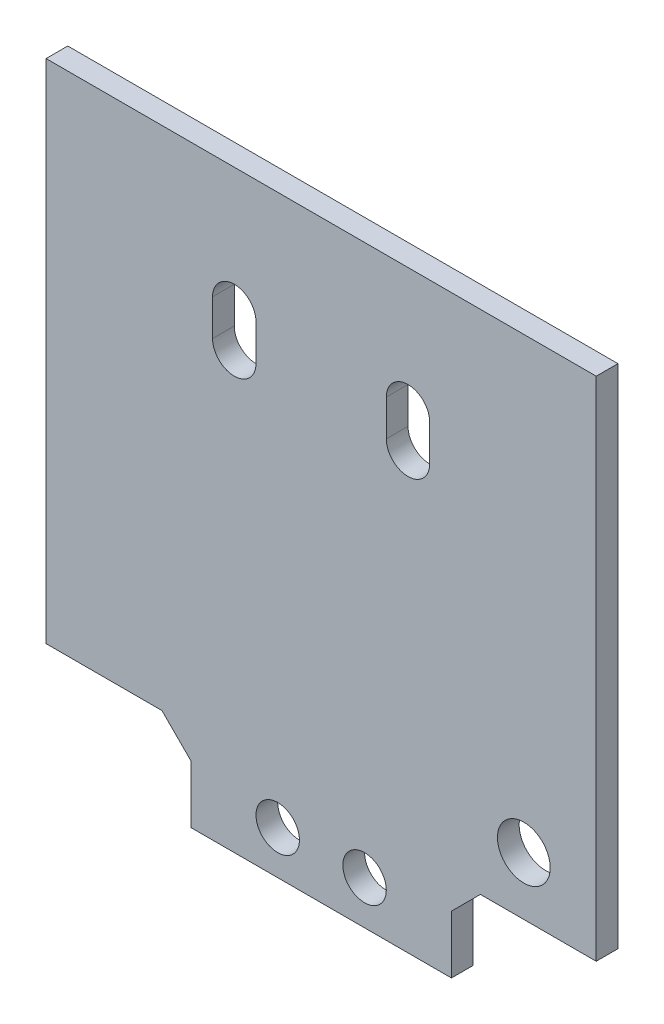
ISO-10303-21;
HEADER;
FILE_DESCRIPTION(('STEP AP214'),'2;1');
FILE_NAME('part.step','',(''),(''),'','','');
FILE_SCHEMA(('AUTOMOTIVE_DESIGN { 1 0 10303 214 1 1 1 1 }'));
ENDSEC;
DATA;
#1=APPLICATION_CONTEXT('core data for automotive mechanical design processes');
#2=APPLICATION_PROTOCOL_DEFINITION('international standard','automotive_design',2000,#1);
#3=PRODUCT_CONTEXT('',#1,'mechanical');
#4=PRODUCT('Part','Part','',(#3));
#5=PRODUCT_RELATED_PRODUCT_CATEGORY('part','',(#4));
#6=PRODUCT_DEFINITION_FORMATION('','',#4);
#7=PRODUCT_DEFINITION_CONTEXT('part definition',#1,'design');
#8=PRODUCT_DEFINITION('design','',#6,#7);
#9=PRODUCT_DEFINITION_SHAPE('','',#8);
#10=(LENGTH_UNIT() NAMED_UNIT(*) SI_UNIT(.MILLI.,.METRE.));
#11=(NAMED_UNIT(*) PLANE_ANGLE_UNIT() SI_UNIT($,.RADIAN.));
#12=(NAMED_UNIT(*) SI_UNIT($,.STERADIAN.) SOLID_ANGLE_UNIT());
#13=UNCERTAINTY_MEASURE_WITH_UNIT(LENGTH_MEASURE(1.E-05),#10,'distance_accuracy_value','');
#14=(GEOMETRIC_REPRESENTATION_CONTEXT(3) GLOBAL_UNCERTAINTY_ASSIGNED_CONTEXT((#13)) GLOBAL_UNIT_ASSIGNED_CONTEXT((#10,
#11,#12)) REPRESENTATION_CONTEXT('',''));
#15=CARTESIAN_POINT('',(0.,0.,0.));
#16=DIRECTION('',(0.,0.,1.));
#17=DIRECTION('',(1.,0.,0.));
#18=AXIS2_PLACEMENT_3D('',#15,#16,#17);
#19=CARTESIAN_POINT('',(0.,0.,1.5));
#20=DIRECTION('',(0.,0.,-1.));
#21=DIRECTION('',(-1.,0.,0.));
#22=AXIS2_PLACEMENT_3D('',#19,#20,#21);
#23=PLANE('',#22);
#24=CARTESIAN_POINT('',(25.,-8.5,1.5));
#25=DIRECTION('',(0.,0.,1.));
#26=DIRECTION('',(1.,0.,0.));
#27=AXIS2_PLACEMENT_3D('',#24,#25,#26);
#28=CIRCLE('',#27,1.50000000000001);
#29=CARTESIAN_POINT('',(26.5,-8.5,1.5));
#30=VERTEX_POINT('',#29);
#31=CARTESIAN_POINT('',(23.5,-8.5,1.5));
#32=VERTEX_POINT('',#31);
#33=EDGE_CURVE('E201',#30,#32,#28,.T.);
#34=ORIENTED_EDGE('',*,*,#33,.F.);
#35=DIRECTION('',(0.,1.,0.));
#36=VECTOR('',#35,1.);
#37=CARTESIAN_POINT('',(26.5,-8.5,1.5));
#38=LINE('',#37,#36);
#39=CARTESIAN_POINT('',(26.5,-11.,1.5));
#40=VERTEX_POINT('',#39);
#41=EDGE_CURVE('E209',#40,#30,#38,.T.);
#42=ORIENTED_EDGE('',*,*,#41,.F.);
#43=CARTESIAN_POINT('',(25.,-11.,1.5));
#44=DIRECTION('',(0.,0.,1.));
#45=DIRECTION('',(1.,0.,0.));
#46=AXIS2_PLACEMENT_3D('',#43,#44,#45);
#47=CIRCLE('',#46,1.49999999999999);
#48=CARTESIAN_POINT('',(23.5,-11.,1.5));
#49=VERTEX_POINT('',#48);
#50=EDGE_CURVE('E206',#49,#40,#47,.T.);
#51=ORIENTED_EDGE('',*,*,#50,.F.);
#52=DIRECTION('',(0.,-1.,0.));
#53=VECTOR('',#52,1.);
#54=CARTESIAN_POINT('',(23.5,-8.5,1.5));
#55=LINE('',#54,#53);
#56=EDGE_CURVE('E203',#32,#49,#55,.T.);
#57=ORIENTED_EDGE('',*,*,#56,.F.);
#58=EDGE_LOOP('',(#34,#42,#51,#57));
#59=FACE_BOUND('',#58,.T.);
#60=DIRECTION('',(0.,-1.,0.));
#61=VECTOR('',#60,1.);
#62=CARTESIAN_POINT('',(0.,-35.,1.5));
#63=LINE('',#62,#61);
#64=CARTESIAN_POINT('',(0.,0.,1.5));
#65=VERTEX_POINT('',#64);
#66=CARTESIAN_POINT('',(0.,-35.,1.5));
#67=VERTEX_POINT('',#66);
#68=EDGE_CURVE('E250',#65,#67,#63,.T.);
#69=ORIENTED_EDGE('',*,*,#68,.T.);
#70=DIRECTION('',(1.,0.,0.));
#71=VECTOR('',#70,1.);
#72=CARTESIAN_POINT('',(5.88929889298893,-35.,1.5));
#73=LINE('',#72,#71);
#74=CARTESIAN_POINT('',(8.00000000000001,-35.,1.5));
#75=VERTEX_POINT('',#74);
#76=EDGE_CURVE('E253',#67,#75,#73,.T.);
#77=ORIENTED_EDGE('',*,*,#76,.T.);
#78=DIRECTION('',(-0.707106781186544,0.707106781186551,0.));
#79=VECTOR('',#78,1.);
#80=CARTESIAN_POINT('',(-13.5,-13.4999999999998,1.5));
#81=LINE('',#80,#79);
#82=CARTESIAN_POINT('',(10.,-37.,1.5));
#83=VERTEX_POINT('',#82);
#84=EDGE_CURVE('E315',#75,#83,#81,.F.);
#85=ORIENTED_EDGE('',*,*,#84,.T.);
#86=DIRECTION('',(0.,-1.,0.));
#87=VECTOR('',#86,1.);
#88=CARTESIAN_POINT('',(10.,-35.,1.5));
#89=LINE('',#88,#87);
#90=CARTESIAN_POINT('',(10.,-41.,1.5));
#91=VERTEX_POINT('',#90);
#92=EDGE_CURVE('E257',#83,#91,#89,.T.);
#93=ORIENTED_EDGE('',*,*,#92,.T.);
#94=DIRECTION('',(1.,0.,0.));
#95=VECTOR('',#94,1.);
#96=CARTESIAN_POINT('',(28.,-41.,1.5));
#97=LINE('',#96,#95);
#98=CARTESIAN_POINT('',(28.,-41.,1.5));
#99=VERTEX_POINT('',#98);
#100=EDGE_CURVE('E259',#91,#99,#97,.T.);
#101=ORIENTED_EDGE('',*,*,#100,.T.);
#102=DIRECTION('',(0.,1.,0.));
#103=VECTOR('',#102,1.);
#104=CARTESIAN_POINT('',(28.,-40.3970599589862,1.5));
#105=LINE('',#104,#103);
#106=CARTESIAN_POINT('',(28.,-37.,1.5));
#107=VERTEX_POINT('',#106);
#108=EDGE_CURVE('E261',#99,#107,#105,.T.);
#109=ORIENTED_EDGE('',*,*,#108,.T.);
#110=DIRECTION('',(-0.707106781186551,-0.707106781186544,0.));
#111=VECTOR('',#110,1.);
#112=CARTESIAN_POINT('',(32.4999999999999,-32.5000000000002,1.5));
#113=LINE('',#112,#111);
#114=CARTESIAN_POINT('',(30.,-35.,1.5));
#115=VERTEX_POINT('',#114);
#116=EDGE_CURVE('E11',#107,#115,#113,.F.);
#117=ORIENTED_EDGE('',*,*,#116,.T.);
#118=DIRECTION('',(1.,0.,0.));
#119=VECTOR('',#118,1.);
#120=CARTESIAN_POINT('',(31.0601126882369,-35.,1.5));
#121=LINE('',#120,#119);
#122=CARTESIAN_POINT('',(38.,-35.,1.5));
#123=VERTEX_POINT('',#122);
#124=EDGE_CURVE('E263',#115,#123,#121,.T.);
#125=ORIENTED_EDGE('',*,*,#124,.T.);
#126=DIRECTION('',(0.,1.,0.));
#127=VECTOR('',#126,1.);
#128=CARTESIAN_POINT('',(38.,0.,1.5));
#129=LINE('',#128,#127);
#130=CARTESIAN_POINT('',(38.,0.,1.5));
#131=VERTEX_POINT('',#130);
#132=EDGE_CURVE('E265',#123,#131,#129,.T.);
#133=ORIENTED_EDGE('',*,*,#132,.T.);
#134=DIRECTION('',(-1.,0.,0.));
#135=VECTOR('',#134,1.);
#136=CARTESIAN_POINT('',(0.,0.,1.5));
#137=LINE('',#136,#135);
#138=EDGE_CURVE('E267',#131,#65,#137,.T.);
#139=ORIENTED_EDGE('',*,*,#138,.T.);
#140=EDGE_LOOP('',(#69,#77,#85,#93,#101,#109,#117,#125,#133,#139));
#141=FACE_BOUND('',#140,.T.);
#142=CARTESIAN_POINT('',(16.,-38.,1.5));
#143=DIRECTION('',(0.,0.,1.));
#144=DIRECTION('',(1.,0.,0.));
#145=AXIS2_PLACEMENT_3D('',#142,#143,#144);
#146=CIRCLE('',#145,1.5);
#147=CARTESIAN_POINT('',(17.5,-38.,1.5));
#148=VERTEX_POINT('',#147);
#149=EDGE_CURVE('E244',#148,#148,#146,.T.);
#150=ORIENTED_EDGE('',*,*,#149,.F.);
#151=EDGE_LOOP('',(#150));
#152=FACE_BOUND('',#151,.T.);
#153=CARTESIAN_POINT('',(22.,-38.,1.5));
#154=DIRECTION('',(0.,0.,1.));
#155=DIRECTION('',(1.,0.,0.));
#156=AXIS2_PLACEMENT_3D('',#153,#154,#155);
#157=CIRCLE('',#156,1.5);
#158=CARTESIAN_POINT('',(23.5,-38.,1.5));
#159=VERTEX_POINT('',#158);
#160=EDGE_CURVE('E238',#159,#159,#157,.T.);
#161=ORIENTED_EDGE('',*,*,#160,.F.);
#162=EDGE_LOOP('',(#161));
#163=FACE_BOUND('',#162,.T.);
#164=CARTESIAN_POINT('',(33.,-31.,1.5));
#165=DIRECTION('',(0.,0.,1.));
#166=DIRECTION('',(1.,0.,0.));
#167=AXIS2_PLACEMENT_3D('',#164,#165,#166);
#168=CIRCLE('',#167,1.82239288771104);
#169=CARTESIAN_POINT('',(34.822392887711,-31.,1.5));
#170=VERTEX_POINT('',#169);
#171=EDGE_CURVE('E232',#170,#170,#168,.T.);
#172=ORIENTED_EDGE('',*,*,#171,.F.);
#173=EDGE_LOOP('',(#172));
#174=FACE_BOUND('',#173,.T.);
#175=CARTESIAN_POINT('',(13.,-8.5,1.5));
#176=DIRECTION('',(0.,0.,1.));
#177=DIRECTION('',(-1.,0.,0.));
#178=AXIS2_PLACEMENT_3D('',#175,#176,#177);
#179=CIRCLE('',#178,1.50000000000001);
#180=CARTESIAN_POINT('',(14.5,-8.5,1.5));
#181=VERTEX_POINT('',#180);
#182=CARTESIAN_POINT('',(11.5,-8.5,1.5));
#183=VERTEX_POINT('',#182);
#184=EDGE_CURVE('E160',#181,#183,#179,.T.);
#185=ORIENTED_EDGE('',*,*,#184,.F.);
#186=DIRECTION('',(0.,1.,0.));
#187=VECTOR('',#186,1.);
#188=CARTESIAN_POINT('',(14.5,-8.5,1.5));
#189=LINE('',#188,#187);
#190=CARTESIAN_POINT('',(14.5,-11.,1.5));
#191=VERTEX_POINT('',#190);
#192=EDGE_CURVE('E185',#191,#181,#189,.T.);
#193=ORIENTED_EDGE('',*,*,#192,.F.);
#194=CARTESIAN_POINT('',(13.,-11.,1.5));
#195=DIRECTION('',(0.,0.,1.));
#196=DIRECTION('',(-1.,0.,0.));
#197=AXIS2_PLACEMENT_3D('',#194,#195,#196);
#198=CIRCLE('',#197,1.49999999999999);
#199=CARTESIAN_POINT('',(11.5,-11.,1.5));
#200=VERTEX_POINT('',#199);
#201=EDGE_CURVE('E183',#200,#191,#198,.T.);
#202=ORIENTED_EDGE('',*,*,#201,.F.);
#203=DIRECTION('',(0.,-1.,0.));
#204=VECTOR('',#203,1.);
#205=CARTESIAN_POINT('',(11.5,-8.5,1.5));
#206=LINE('',#205,#204);
#207=EDGE_CURVE('E170',#183,#200,#206,.T.);
#208=ORIENTED_EDGE('',*,*,#207,.F.);
#209=EDGE_LOOP('',(#185,#193,#202,#208));
#210=FACE_BOUND('',#209,.T.);
#211=ADVANCED_FACE('F35',(#59,#141,#152,#163,#174,#210),#23,.F.);
#212=CARTESIAN_POINT('',(0.,0.,0.));
#213=DIRECTION('',(0.,0.,-1.));
#214=DIRECTION('',(-1.,0.,0.));
#215=AXIS2_PLACEMENT_3D('',#212,#213,#214);
#216=PLANE('',#215);
#217=CARTESIAN_POINT('',(22.,-38.,0.));
#218=DIRECTION('',(0.,0.,1.));
#219=DIRECTION('',(1.,0.,0.));
#220=AXIS2_PLACEMENT_3D('',#217,#218,#219);
#221=CIRCLE('',#220,1.5);
#222=CARTESIAN_POINT('',(23.5,-38.,0.));
#223=VERTEX_POINT('',#222);
#224=EDGE_CURVE('E235',#223,#223,#221,.T.);
#225=ORIENTED_EDGE('',*,*,#224,.T.);
#226=EDGE_LOOP('',(#225));
#227=FACE_BOUND('',#226,.T.);
#228=DIRECTION('',(0.,-1.,0.));
#229=VECTOR('',#228,1.);
#230=CARTESIAN_POINT('',(0.,-35.,0.));
#231=LINE('',#230,#229);
#232=CARTESIAN_POINT('',(0.,0.,0.));
#233=VERTEX_POINT('',#232);
#234=CARTESIAN_POINT('',(0.,-35.,0.));
#235=VERTEX_POINT('',#234);
#236=EDGE_CURVE('E247',#233,#235,#231,.T.);
#237=ORIENTED_EDGE('',*,*,#236,.F.);
#238=DIRECTION('',(-1.,0.,0.));
#239=VECTOR('',#238,1.);
#240=CARTESIAN_POINT('',(0.,0.,0.));
#241=LINE('',#240,#239);
#242=CARTESIAN_POINT('',(38.,0.,0.));
#243=VERTEX_POINT('',#242);
#244=EDGE_CURVE('E254',#243,#233,#241,.T.);
#245=ORIENTED_EDGE('',*,*,#244,.F.);
#246=DIRECTION('',(0.,1.,0.));
#247=VECTOR('',#246,1.);
#248=CARTESIAN_POINT('',(38.,0.,0.));
#249=LINE('',#248,#247);
#250=CARTESIAN_POINT('',(38.,-35.,0.));
#251=VERTEX_POINT('',#250);
#252=EDGE_CURVE('E284',#251,#243,#249,.T.);
#253=ORIENTED_EDGE('',*,*,#252,.F.);
#254=DIRECTION('',(1.,0.,0.));
#255=VECTOR('',#254,1.);
#256=CARTESIAN_POINT('',(38.,-35.,0.));
#257=LINE('',#256,#255);
#258=CARTESIAN_POINT('',(30.,-35.,0.));
#259=VERTEX_POINT('',#258);
#260=EDGE_CURVE('E282',#259,#251,#257,.T.);
#261=ORIENTED_EDGE('',*,*,#260,.F.);
#262=DIRECTION('',(0.707106781186551,0.707106781186544,0.));
#263=VECTOR('',#262,1.);
#264=CARTESIAN_POINT('',(30.,-35.,0.));
#265=LINE('',#264,#263);
#266=CARTESIAN_POINT('',(28.,-37.,0.));
#267=VERTEX_POINT('',#266);
#268=EDGE_CURVE('E43',#259,#267,#265,.F.);
#269=ORIENTED_EDGE('',*,*,#268,.T.);
#270=DIRECTION('',(0.,1.,0.));
#271=VECTOR('',#270,1.);
#272=CARTESIAN_POINT('',(28.,-35.,0.));
#273=LINE('',#272,#271);
#274=CARTESIAN_POINT('',(28.,-41.,0.));
#275=VERTEX_POINT('',#274);
#276=EDGE_CURVE('E280',#275,#267,#273,.T.);
#277=ORIENTED_EDGE('',*,*,#276,.F.);
#278=DIRECTION('',(1.,0.,0.));
#279=VECTOR('',#278,1.);
#280=CARTESIAN_POINT('',(28.,-41.,0.));
#281=LINE('',#280,#279);
#282=CARTESIAN_POINT('',(10.,-41.,0.));
#283=VERTEX_POINT('',#282);
#284=EDGE_CURVE('E277',#283,#275,#281,.T.);
#285=ORIENTED_EDGE('',*,*,#284,.F.);
#286=DIRECTION('',(0.,-1.,0.));
#287=VECTOR('',#286,1.);
#288=CARTESIAN_POINT('',(10.,-41.,0.));
#289=LINE('',#288,#287);
#290=CARTESIAN_POINT('',(10.,-37.,0.));
#291=VERTEX_POINT('',#290);
#292=EDGE_CURVE('E275',#291,#283,#289,.T.);
#293=ORIENTED_EDGE('',*,*,#292,.F.);
#294=DIRECTION('',(0.707106781186544,-0.707106781186551,0.));
#295=VECTOR('',#294,1.);
#296=CARTESIAN_POINT('',(10.,-37.,0.));
#297=LINE('',#296,#295);
#298=CARTESIAN_POINT('',(8.00000000000001,-35.,0.));
#299=VERTEX_POINT('',#298);
#300=EDGE_CURVE('E313',#291,#299,#297,.F.);
#301=ORIENTED_EDGE('',*,*,#300,.T.);
#302=DIRECTION('',(1.,0.,0.));
#303=VECTOR('',#302,1.);
#304=CARTESIAN_POINT('',(5.88929889298893,-35.,0.));
#305=LINE('',#304,#303);
#306=EDGE_CURVE('E272',#235,#299,#305,.T.);
#307=ORIENTED_EDGE('',*,*,#306,.F.);
#308=EDGE_LOOP('',(#237,#245,#253,#261,#269,#277,#285,#293,#301,#307));
#309=FACE_BOUND('',#308,.T.);
#310=CARTESIAN_POINT('',(16.,-38.,0.));
#311=DIRECTION('',(0.,0.,1.));
#312=DIRECTION('',(1.,0.,0.));
#313=AXIS2_PLACEMENT_3D('',#310,#311,#312);
#314=CIRCLE('',#313,1.5);
#315=CARTESIAN_POINT('',(17.5,-38.,0.));
#316=VERTEX_POINT('',#315);
#317=EDGE_CURVE('E241',#316,#316,#314,.T.);
#318=ORIENTED_EDGE('',*,*,#317,.T.);
#319=EDGE_LOOP('',(#318));
#320=FACE_BOUND('',#319,.T.);
#321=CARTESIAN_POINT('',(33.,-31.,0.));
#322=DIRECTION('',(0.,0.,1.));
#323=DIRECTION('',(1.,0.,0.));
#324=AXIS2_PLACEMENT_3D('',#321,#322,#323);
#325=CIRCLE('',#324,1.82239288771104);
#326=CARTESIAN_POINT('',(34.822392887711,-31.,0.));
#327=VERTEX_POINT('',#326);
#328=EDGE_CURVE('E231',#327,#327,#325,.T.);
#329=ORIENTED_EDGE('',*,*,#328,.T.);
#330=EDGE_LOOP('',(#329));
#331=FACE_BOUND('',#330,.T.);
#332=DIRECTION('',(0.,1.,0.));
#333=VECTOR('',#332,1.);
#334=CARTESIAN_POINT('',(26.5,-8.5,0.));
#335=LINE('',#334,#333);
#336=CARTESIAN_POINT('',(26.5,-11.,0.));
#337=VERTEX_POINT('',#336);
#338=CARTESIAN_POINT('',(26.5,-8.5,0.));
#339=VERTEX_POINT('',#338);
#340=EDGE_CURVE('E204',#337,#339,#335,.T.);
#341=ORIENTED_EDGE('',*,*,#340,.T.);
#342=CARTESIAN_POINT('',(25.,-8.5,0.));
#343=DIRECTION('',(0.,0.,1.));
#344=DIRECTION('',(1.,0.,0.));
#345=AXIS2_PLACEMENT_3D('',#342,#343,#344);
#346=CIRCLE('',#345,1.50000000000001);
#347=CARTESIAN_POINT('',(23.5,-8.5,0.));
#348=VERTEX_POINT('',#347);
#349=EDGE_CURVE('E178',#339,#348,#346,.T.);
#350=ORIENTED_EDGE('',*,*,#349,.T.);
#351=DIRECTION('',(0.,-1.,0.));
#352=VECTOR('',#351,1.);
#353=CARTESIAN_POINT('',(23.5,-8.5,0.));
#354=LINE('',#353,#352);
#355=CARTESIAN_POINT('',(23.5,-11.,0.));
#356=VERTEX_POINT('',#355);
#357=EDGE_CURVE('E214',#348,#356,#354,.T.);
#358=ORIENTED_EDGE('',*,*,#357,.T.);
#359=CARTESIAN_POINT('',(25.,-11.,0.));
#360=DIRECTION('',(0.,0.,1.));
#361=DIRECTION('',(1.,0.,0.));
#362=AXIS2_PLACEMENT_3D('',#359,#360,#361);
#363=CIRCLE('',#362,1.49999999999999);
#364=EDGE_CURVE('E217',#356,#337,#363,.T.);
#365=ORIENTED_EDGE('',*,*,#364,.T.);
#366=EDGE_LOOP('',(#341,#350,#358,#365));
#367=FACE_BOUND('',#366,.T.);
#368=DIRECTION('',(0.,1.,0.));
#369=VECTOR('',#368,1.);
#370=CARTESIAN_POINT('',(14.5,-8.5,0.));
#371=LINE('',#370,#369);
#372=CARTESIAN_POINT('',(14.5,-11.,0.));
#373=VERTEX_POINT('',#372);
#374=CARTESIAN_POINT('',(14.5,-8.5,0.));
#375=VERTEX_POINT('',#374);
#376=EDGE_CURVE('E171',#373,#375,#371,.T.);
#377=ORIENTED_EDGE('',*,*,#376,.T.);
#378=CARTESIAN_POINT('',(13.,-8.5,0.));
#379=DIRECTION('',(0.,0.,1.));
#380=DIRECTION('',(-1.,0.,0.));
#381=AXIS2_PLACEMENT_3D('',#378,#379,#380);
#382=CIRCLE('',#381,1.50000000000001);
#383=CARTESIAN_POINT('',(11.5,-8.5,0.));
#384=VERTEX_POINT('',#383);
#385=EDGE_CURVE('E189',#375,#384,#382,.T.);
#386=ORIENTED_EDGE('',*,*,#385,.T.);
#387=DIRECTION('',(0.,-1.,0.));
#388=VECTOR('',#387,1.);
#389=CARTESIAN_POINT('',(11.5,-8.5,0.));
#390=LINE('',#389,#388);
#391=CARTESIAN_POINT('',(11.5,-11.,0.));
#392=VERTEX_POINT('',#391);
#393=EDGE_CURVE('E177',#384,#392,#390,.T.);
#394=ORIENTED_EDGE('',*,*,#393,.T.);
#395=CARTESIAN_POINT('',(13.,-11.,0.));
#396=DIRECTION('',(0.,0.,1.));
#397=DIRECTION('',(-1.,0.,0.));
#398=AXIS2_PLACEMENT_3D('',#395,#396,#397);
#399=CIRCLE('',#398,1.49999999999999);
#400=EDGE_CURVE('E192',#392,#373,#399,.T.);
#401=ORIENTED_EDGE('',*,*,#400,.T.);
#402=EDGE_LOOP('',(#377,#386,#394,#401));
#403=FACE_BOUND('',#402,.T.);
#404=ADVANCED_FACE('F330',(#227,#309,#320,#331,#367,#403),#216,.T.);
#405=CARTESIAN_POINT('',(0.,-35.,1.5));
#406=DIRECTION('',(1.,0.,0.));
#407=DIRECTION('',(0.,0.,-1.));
#408=AXIS2_PLACEMENT_3D('',#405,#406,#407);
#409=PLANE('',#408);
#410=ORIENTED_EDGE('',*,*,#236,.T.);
#411=DIRECTION('',(0.,0.,-1.));
#412=VECTOR('',#411,1.);
#413=CARTESIAN_POINT('',(0.,-35.,1.5));
#414=LINE('',#413,#412);
#415=EDGE_CURVE('E301',#67,#235,#414,.T.);
#416=ORIENTED_EDGE('',*,*,#415,.F.);
#417=ORIENTED_EDGE('',*,*,#68,.F.);
#418=DIRECTION('',(0.,0.,-1.));
#419=VECTOR('',#418,1.);
#420=CARTESIAN_POINT('',(0.,0.,1.5));
#421=LINE('',#420,#419);
#422=EDGE_CURVE('E269',#65,#233,#421,.T.);
#423=ORIENTED_EDGE('',*,*,#422,.T.);
#424=EDGE_LOOP('',(#410,#416,#417,#423));
#425=FACE_BOUND('',#424,.T.);
#426=ADVANCED_FACE('F338',(#425),#409,.F.);
#427=CARTESIAN_POINT('',(5.88929889298893,-35.,1.5));
#428=DIRECTION('',(0.,1.,0.));
#429=DIRECTION('',(0.,0.,1.));
#430=AXIS2_PLACEMENT_3D('',#427,#428,#429);
#431=PLANE('',#430);
#432=ORIENTED_EDGE('',*,*,#306,.T.);
#433=DIRECTION('',(0.,0.,1.));
#434=VECTOR('',#433,1.);
#435=CARTESIAN_POINT('',(8.00000000000001,-35.,1.5));
#436=LINE('',#435,#434);
#437=EDGE_CURVE('E307',#299,#75,#436,.T.);
#438=ORIENTED_EDGE('',*,*,#437,.T.);
#439=ORIENTED_EDGE('',*,*,#76,.F.);
#440=ORIENTED_EDGE('',*,*,#415,.T.);
#441=EDGE_LOOP('',(#432,#438,#439,#440));
#442=FACE_BOUND('',#441,.T.);
#443=ADVANCED_FACE('F334',(#442),#431,.F.);
#444=CARTESIAN_POINT('',(10.,-41.,1.5));
#445=DIRECTION('',(1.,0.,0.));
#446=DIRECTION('',(0.,0.,-1.));
#447=AXIS2_PLACEMENT_3D('',#444,#445,#446);
#448=PLANE('',#447);
#449=ORIENTED_EDGE('',*,*,#92,.F.);
#450=DIRECTION('',(0.,0.,-1.));
#451=VECTOR('',#450,1.);
#452=CARTESIAN_POINT('',(10.,-37.,0.));
#453=LINE('',#452,#451);
#454=EDGE_CURVE('E304',#83,#291,#453,.T.);
#455=ORIENTED_EDGE('',*,*,#454,.T.);
#456=ORIENTED_EDGE('',*,*,#292,.T.);
#457=DIRECTION('',(0.,0.,-1.));
#458=VECTOR('',#457,1.);
#459=CARTESIAN_POINT('',(10.,-41.,1.5));
#460=LINE('',#459,#458);
#461=EDGE_CURVE('E298',#91,#283,#460,.T.);
#462=ORIENTED_EDGE('',*,*,#461,.F.);
#463=EDGE_LOOP('',(#449,#455,#456,#462));
#464=FACE_BOUND('',#463,.T.);
#465=ADVANCED_FACE('F325',(#464),#448,.F.);
#466=CARTESIAN_POINT('',(28.,-41.,1.5));
#467=DIRECTION('',(0.,1.,0.));
#468=DIRECTION('',(0.,0.,1.));
#469=AXIS2_PLACEMENT_3D('',#466,#467,#468);
#470=PLANE('',#469);
#471=ORIENTED_EDGE('',*,*,#284,.T.);
#472=DIRECTION('',(0.,0.,-1.));
#473=VECTOR('',#472,1.);
#474=CARTESIAN_POINT('',(28.,-41.,1.5));
#475=LINE('',#474,#473);
#476=EDGE_CURVE('E295',#99,#275,#475,.T.);
#477=ORIENTED_EDGE('',*,*,#476,.F.);
#478=ORIENTED_EDGE('',*,*,#100,.F.);
#479=ORIENTED_EDGE('',*,*,#461,.T.);
#480=EDGE_LOOP('',(#471,#477,#478,#479));
#481=FACE_BOUND('',#480,.T.);
#482=ADVANCED_FACE('F359',(#481),#470,.F.);
#483=CARTESIAN_POINT('',(28.,-35.,1.5));
#484=DIRECTION('',(-1.,0.,0.));
#485=DIRECTION('',(0.,0.,1.));
#486=AXIS2_PLACEMENT_3D('',#483,#484,#485);
#487=PLANE('',#486);
#488=ORIENTED_EDGE('',*,*,#276,.T.);
#489=DIRECTION('',(0.,0.,1.));
#490=VECTOR('',#489,1.);
#491=CARTESIAN_POINT('',(28.,-37.,1.5));
#492=LINE('',#491,#490);
#493=EDGE_CURVE('E50',#267,#107,#492,.T.);
#494=ORIENTED_EDGE('',*,*,#493,.T.);
#495=ORIENTED_EDGE('',*,*,#108,.F.);
#496=ORIENTED_EDGE('',*,*,#476,.T.);
#497=EDGE_LOOP('',(#488,#494,#495,#496));
#498=FACE_BOUND('',#497,.T.);
#499=ADVANCED_FACE('F357',(#498),#487,.F.);
#500=CARTESIAN_POINT('',(38.,-35.,1.5));
#501=DIRECTION('',(0.,1.,0.));
#502=DIRECTION('',(0.,0.,1.));
#503=AXIS2_PLACEMENT_3D('',#500,#501,#502);
#504=PLANE('',#503);
#505=ORIENTED_EDGE('',*,*,#124,.F.);
#506=DIRECTION('',(0.,0.,-1.));
#507=VECTOR('',#506,1.);
#508=CARTESIAN_POINT('',(30.,-35.,0.));
#509=LINE('',#508,#507);
#510=EDGE_CURVE('E309',#115,#259,#509,.T.);
#511=ORIENTED_EDGE('',*,*,#510,.T.);
#512=ORIENTED_EDGE('',*,*,#260,.T.);
#513=DIRECTION('',(0.,0.,-1.));
#514=VECTOR('',#513,1.);
#515=CARTESIAN_POINT('',(38.,-35.,1.5));
#516=LINE('',#515,#514);
#517=EDGE_CURVE('E292',#123,#251,#516,.T.);
#518=ORIENTED_EDGE('',*,*,#517,.F.);
#519=EDGE_LOOP('',(#505,#511,#512,#518));
#520=FACE_BOUND('',#519,.T.);
#521=ADVANCED_FACE('F352',(#520),#504,.F.);
#522=CARTESIAN_POINT('',(38.,0.,1.5));
#523=DIRECTION('',(-1.,0.,0.));
#524=DIRECTION('',(0.,0.,1.));
#525=AXIS2_PLACEMENT_3D('',#522,#523,#524);
#526=PLANE('',#525);
#527=ORIENTED_EDGE('',*,*,#252,.T.);
#528=DIRECTION('',(0.,0.,-1.));
#529=VECTOR('',#528,1.);
#530=CARTESIAN_POINT('',(38.,0.,1.5));
#531=LINE('',#530,#529);
#532=EDGE_CURVE('E289',#131,#243,#531,.T.);
#533=ORIENTED_EDGE('',*,*,#532,.F.);
#534=ORIENTED_EDGE('',*,*,#132,.F.);
#535=ORIENTED_EDGE('',*,*,#517,.T.);
#536=EDGE_LOOP('',(#527,#533,#534,#535));
#537=FACE_BOUND('',#536,.T.);
#538=ADVANCED_FACE('F348',(#537),#526,.F.);
#539=CARTESIAN_POINT('',(0.,0.,1.5));
#540=DIRECTION('',(0.,-1.,0.));
#541=DIRECTION('',(0.,0.,-1.));
#542=AXIS2_PLACEMENT_3D('',#539,#540,#541);
#543=PLANE('',#542);
#544=ORIENTED_EDGE('',*,*,#244,.T.);
#545=ORIENTED_EDGE('',*,*,#422,.F.);
#546=ORIENTED_EDGE('',*,*,#138,.F.);
#547=ORIENTED_EDGE('',*,*,#532,.T.);
#548=EDGE_LOOP('',(#544,#545,#546,#547));
#549=FACE_BOUND('',#548,.T.);
#550=ADVANCED_FACE('F343',(#549),#543,.F.);
#551=CARTESIAN_POINT('',(16.,-38.,1.5));
#552=DIRECTION('',(0.,0.,-1.));
#553=DIRECTION('',(-1.,0.,0.));
#554=AXIS2_PLACEMENT_3D('',#551,#552,#553);
#555=CYLINDRICAL_SURFACE('',#554,1.5);
#556=ORIENTED_EDGE('',*,*,#149,.T.);
#557=EDGE_LOOP('',(#556));
#558=FACE_BOUND('',#557,.T.);
#559=ORIENTED_EDGE('',*,*,#317,.F.);
#560=EDGE_LOOP('',(#559));
#561=FACE_BOUND('',#560,.T.);
#562=ADVANCED_FACE('F378',(#558,#561),#555,.F.);
#563=CARTESIAN_POINT('',(22.,-38.,1.5));
#564=DIRECTION('',(0.,0.,-1.));
#565=DIRECTION('',(-1.,0.,0.));
#566=AXIS2_PLACEMENT_3D('',#563,#564,#565);
#567=CYLINDRICAL_SURFACE('',#566,1.5);
#568=ORIENTED_EDGE('',*,*,#160,.T.);
#569=EDGE_LOOP('',(#568));
#570=FACE_BOUND('',#569,.T.);
#571=ORIENTED_EDGE('',*,*,#224,.F.);
#572=EDGE_LOOP('',(#571));
#573=FACE_BOUND('',#572,.T.);
#574=ADVANCED_FACE('F405',(#570,#573),#567,.F.);
#575=CARTESIAN_POINT('',(33.,-31.,1.5));
#576=DIRECTION('',(0.,0.,-1.));
#577=DIRECTION('',(-1.,0.,0.));
#578=AXIS2_PLACEMENT_3D('',#575,#576,#577);
#579=CYLINDRICAL_SURFACE('',#578,1.82239288771104);
#580=ORIENTED_EDGE('',*,*,#171,.T.);
#581=EDGE_LOOP('',(#580));
#582=FACE_BOUND('',#581,.T.);
#583=ORIENTED_EDGE('',*,*,#328,.F.);
#584=EDGE_LOOP('',(#583));
#585=FACE_BOUND('',#584,.T.);
#586=ADVANCED_FACE('F412',(#582,#585),#579,.F.);
#587=CARTESIAN_POINT('',(25.,-8.5,1.5));
#588=DIRECTION('',(0.,0.,-1.));
#589=DIRECTION('',(-1.,0.,0.));
#590=AXIS2_PLACEMENT_3D('',#587,#588,#589);
#591=CYLINDRICAL_SURFACE('',#590,1.50000000000001);
#592=ORIENTED_EDGE('',*,*,#349,.F.);
#593=DIRECTION('',(0.,0.,-1.));
#594=VECTOR('',#593,1.);
#595=CARTESIAN_POINT('',(26.5,-8.5,1.5));
#596=LINE('',#595,#594);
#597=EDGE_CURVE('E211',#30,#339,#596,.T.);
#598=ORIENTED_EDGE('',*,*,#597,.F.);
#599=ORIENTED_EDGE('',*,*,#33,.T.);
#600=DIRECTION('',(0.,0.,-1.));
#601=VECTOR('',#600,1.);
#602=CARTESIAN_POINT('',(23.5,-8.5,1.5));
#603=LINE('',#602,#601);
#604=EDGE_CURVE('E228',#32,#348,#603,.T.);
#605=ORIENTED_EDGE('',*,*,#604,.T.);
#606=EDGE_LOOP('',(#592,#598,#599,#605));
#607=FACE_BOUND('',#606,.T.);
#608=ADVANCED_FACE('F419',(#607),#591,.F.);
#609=CARTESIAN_POINT('',(23.5,-8.5,1.5));
#610=DIRECTION('',(1.,0.,0.));
#611=DIRECTION('',(0.,1.,0.));
#612=AXIS2_PLACEMENT_3D('',#609,#610,#611);
#613=PLANE('',#612);
#614=ORIENTED_EDGE('',*,*,#357,.F.);
#615=ORIENTED_EDGE('',*,*,#604,.F.);
#616=ORIENTED_EDGE('',*,*,#56,.T.);
#617=DIRECTION('',(0.,0.,-1.));
#618=VECTOR('',#617,1.);
#619=CARTESIAN_POINT('',(23.5,-11.,1.5));
#620=LINE('',#619,#618);
#621=EDGE_CURVE('E226',#49,#356,#620,.T.);
#622=ORIENTED_EDGE('',*,*,#621,.T.);
#623=EDGE_LOOP('',(#614,#615,#616,#622));
#624=FACE_BOUND('',#623,.T.);
#625=ADVANCED_FACE('F427',(#624),#613,.T.);
#626=CARTESIAN_POINT('',(25.,-11.,1.5));
#627=DIRECTION('',(0.,0.,-1.));
#628=DIRECTION('',(-1.,0.,0.));
#629=AXIS2_PLACEMENT_3D('',#626,#627,#628);
#630=CYLINDRICAL_SURFACE('',#629,1.49999999999999);
#631=ORIENTED_EDGE('',*,*,#364,.F.);
#632=ORIENTED_EDGE('',*,*,#621,.F.);
#633=ORIENTED_EDGE('',*,*,#50,.T.);
#634=DIRECTION('',(0.,0.,-1.));
#635=VECTOR('',#634,1.);
#636=CARTESIAN_POINT('',(26.5,-11.,1.5));
#637=LINE('',#636,#635);
#638=EDGE_CURVE('E224',#40,#337,#637,.T.);
#639=ORIENTED_EDGE('',*,*,#638,.T.);
#640=EDGE_LOOP('',(#631,#632,#633,#639));
#641=FACE_BOUND('',#640,.T.);
#642=ADVANCED_FACE('F435',(#641),#630,.F.);
#643=CARTESIAN_POINT('',(26.5,-8.5,1.5));
#644=DIRECTION('',(-1.,0.,0.));
#645=DIRECTION('',(0.,-1.,0.));
#646=AXIS2_PLACEMENT_3D('',#643,#644,#645);
#647=PLANE('',#646);
#648=ORIENTED_EDGE('',*,*,#340,.F.);
#649=ORIENTED_EDGE('',*,*,#638,.F.);
#650=ORIENTED_EDGE('',*,*,#41,.T.);
#651=ORIENTED_EDGE('',*,*,#597,.T.);
#652=EDGE_LOOP('',(#648,#649,#650,#651));
#653=FACE_BOUND('',#652,.T.);
#654=ADVANCED_FACE('F443',(#653),#647,.T.);
#655=CARTESIAN_POINT('',(13.,-8.5,1.5));
#656=DIRECTION('',(0.,0.,-1.));
#657=DIRECTION('',(-1.,0.,0.));
#658=AXIS2_PLACEMENT_3D('',#655,#656,#657);
#659=CYLINDRICAL_SURFACE('',#658,1.50000000000001);
#660=ORIENTED_EDGE('',*,*,#385,.F.);
#661=DIRECTION('',(0.,0.,-1.));
#662=VECTOR('',#661,1.);
#663=CARTESIAN_POINT('',(14.5,-8.5,1.5));
#664=LINE('',#663,#662);
#665=EDGE_CURVE('E166',#181,#375,#664,.T.);
#666=ORIENTED_EDGE('',*,*,#665,.F.);
#667=ORIENTED_EDGE('',*,*,#184,.T.);
#668=DIRECTION('',(0.,0.,-1.));
#669=VECTOR('',#668,1.);
#670=CARTESIAN_POINT('',(11.5,-8.5,1.5));
#671=LINE('',#670,#669);
#672=EDGE_CURVE('E163',#183,#384,#671,.T.);
#673=ORIENTED_EDGE('',*,*,#672,.T.);
#674=EDGE_LOOP('',(#660,#666,#667,#673));
#675=FACE_BOUND('',#674,.T.);
#676=ADVANCED_FACE('F162',(#675),#659,.F.);
#677=CARTESIAN_POINT('',(11.5,-8.5,1.5));
#678=DIRECTION('',(1.,0.,0.));
#679=DIRECTION('',(0.,1.,0.));
#680=AXIS2_PLACEMENT_3D('',#677,#678,#679);
#681=PLANE('',#680);
#682=ORIENTED_EDGE('',*,*,#393,.F.);
#683=ORIENTED_EDGE('',*,*,#672,.F.);
#684=ORIENTED_EDGE('',*,*,#207,.T.);
#685=DIRECTION('',(0.,0.,-1.));
#686=VECTOR('',#685,1.);
#687=CARTESIAN_POINT('',(11.5,-11.,1.5));
#688=LINE('',#687,#686);
#689=EDGE_CURVE('E179',#200,#392,#688,.T.);
#690=ORIENTED_EDGE('',*,*,#689,.T.);
#691=EDGE_LOOP('',(#682,#683,#684,#690));
#692=FACE_BOUND('',#691,.T.);
#693=ADVANCED_FACE('F174',(#692),#681,.T.);
#694=CARTESIAN_POINT('',(13.,-11.,1.5));
#695=DIRECTION('',(0.,0.,-1.));
#696=DIRECTION('',(-1.,0.,0.));
#697=AXIS2_PLACEMENT_3D('',#694,#695,#696);
#698=CYLINDRICAL_SURFACE('',#697,1.49999999999999);
#699=ORIENTED_EDGE('',*,*,#400,.F.);
#700=ORIENTED_EDGE('',*,*,#689,.F.);
#701=ORIENTED_EDGE('',*,*,#201,.T.);
#702=DIRECTION('',(0.,0.,-1.));
#703=VECTOR('',#702,1.);
#704=CARTESIAN_POINT('',(14.5,-11.,1.5));
#705=LINE('',#704,#703);
#706=EDGE_CURVE('E198',#191,#373,#705,.T.);
#707=ORIENTED_EDGE('',*,*,#706,.T.);
#708=EDGE_LOOP('',(#699,#700,#701,#707));
#709=FACE_BOUND('',#708,.T.);
#710=ADVANCED_FACE('F464',(#709),#698,.F.);
#711=CARTESIAN_POINT('',(14.5,-8.5,1.5));
#712=DIRECTION('',(-1.,0.,0.));
#713=DIRECTION('',(0.,-1.,0.));
#714=AXIS2_PLACEMENT_3D('',#711,#712,#713);
#715=PLANE('',#714);
#716=ORIENTED_EDGE('',*,*,#376,.F.);
#717=ORIENTED_EDGE('',*,*,#706,.F.);
#718=ORIENTED_EDGE('',*,*,#192,.T.);
#719=ORIENTED_EDGE('',*,*,#665,.T.);
#720=EDGE_LOOP('',(#716,#717,#718,#719));
#721=FACE_BOUND('',#720,.T.);
#722=ADVANCED_FACE('F471',(#721),#715,.T.);
#723=CARTESIAN_POINT('',(10.,-37.,1.5));
#724=DIRECTION('',(-0.707106781186551,-0.707106781186544,0.));
#725=DIRECTION('',(0.,0.,1.));
#726=AXIS2_PLACEMENT_3D('',#723,#724,#725);
#727=PLANE('',#726);
#728=ORIENTED_EDGE('',*,*,#84,.F.);
#729=ORIENTED_EDGE('',*,*,#437,.F.);
#730=ORIENTED_EDGE('',*,*,#300,.F.);
#731=ORIENTED_EDGE('',*,*,#454,.F.);
#732=EDGE_LOOP('',(#728,#729,#730,#731));
#733=FACE_BOUND('',#732,.T.);
#734=ADVANCED_FACE('F328',(#733),#727,.T.);
#735=CARTESIAN_POINT('',(30.,-35.,1.5));
#736=DIRECTION('',(0.707106781186544,-0.707106781186551,0.));
#737=DIRECTION('',(0.,0.,1.));
#738=AXIS2_PLACEMENT_3D('',#735,#736,#737);
#739=PLANE('',#738);
#740=ORIENTED_EDGE('',*,*,#116,.F.);
#741=ORIENTED_EDGE('',*,*,#493,.F.);
#742=ORIENTED_EDGE('',*,*,#268,.F.);
#743=ORIENTED_EDGE('',*,*,#510,.F.);
#744=EDGE_LOOP('',(#740,#741,#742,#743));
#745=FACE_BOUND('',#744,.T.);
#746=ADVANCED_FACE('F37',(#745),#739,.T.);
#747=CLOSED_SHELL('',(#211,#404,#426,#443,#465,#482,#499,#521,#538,#550,#562,#574,#586,#608,
#625,#642,#654,#676,#693,#710,#722,#734,#746));
#748=MANIFOLD_SOLID_BREP('B2',#747);
#749=ADVANCED_BREP_SHAPE_REPRESENTATION('',(#18,#748),#14);
#750=SHAPE_DEFINITION_REPRESENTATION(#9,#749);
ENDSEC;
END-ISO-10303-21;
